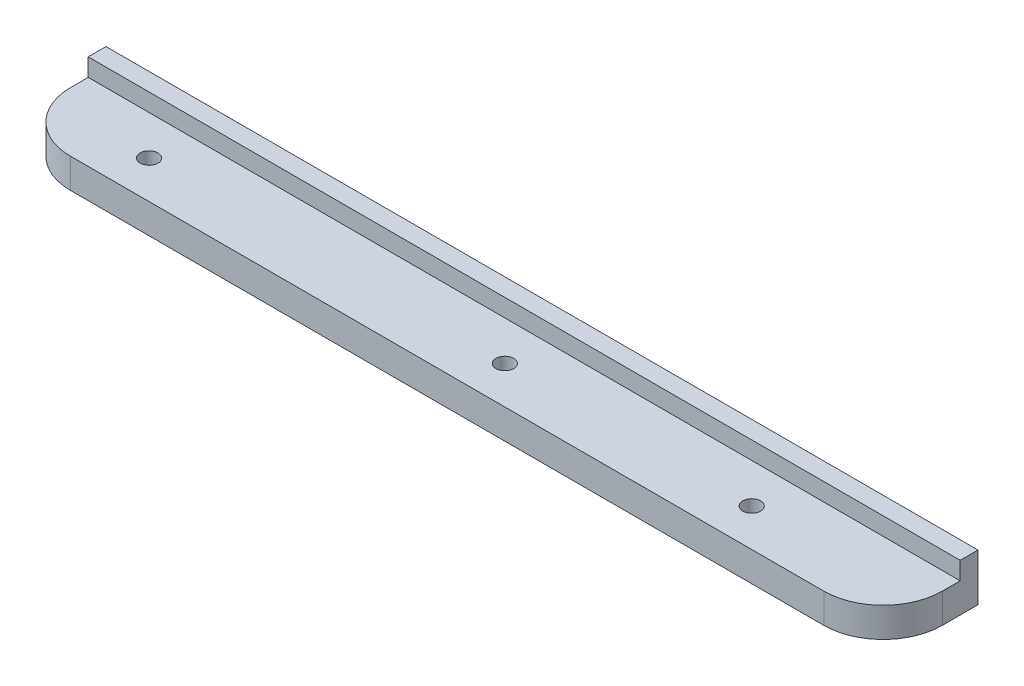
ISO-10303-21;
HEADER;
FILE_DESCRIPTION(('STEP AP214'),'2;1');
FILE_NAME('part.step','',(''),(''),'','','');
FILE_SCHEMA(('AUTOMOTIVE_DESIGN { 1 0 10303 214 1 1 1 1 }'));
ENDSEC;
DATA;
#1=APPLICATION_CONTEXT('core data for automotive mechanical design processes');
#2=APPLICATION_PROTOCOL_DEFINITION('international standard','automotive_design',2000,#1);
#3=PRODUCT_CONTEXT('',#1,'mechanical');
#4=PRODUCT('Part','Part','',(#3));
#5=PRODUCT_RELATED_PRODUCT_CATEGORY('part','',(#4));
#6=PRODUCT_DEFINITION_FORMATION('','',#4);
#7=PRODUCT_DEFINITION_CONTEXT('part definition',#1,'design');
#8=PRODUCT_DEFINITION('design','',#6,#7);
#9=PRODUCT_DEFINITION_SHAPE('','',#8);
#10=(LENGTH_UNIT() NAMED_UNIT(*) SI_UNIT(.MILLI.,.METRE.));
#11=(NAMED_UNIT(*) PLANE_ANGLE_UNIT() SI_UNIT($,.RADIAN.));
#12=(NAMED_UNIT(*) SI_UNIT($,.STERADIAN.) SOLID_ANGLE_UNIT());
#13=UNCERTAINTY_MEASURE_WITH_UNIT(LENGTH_MEASURE(1.E-05),#10,'distance_accuracy_value','');
#14=(GEOMETRIC_REPRESENTATION_CONTEXT(3) GLOBAL_UNCERTAINTY_ASSIGNED_CONTEXT((#13)) GLOBAL_UNIT_ASSIGNED_CONTEXT((#10,
#11,#12)) REPRESENTATION_CONTEXT('',''));
#15=CARTESIAN_POINT('',(0.,0.,0.));
#16=DIRECTION('',(0.,0.,1.));
#17=DIRECTION('',(1.,0.,0.));
#18=AXIS2_PLACEMENT_3D('',#15,#16,#17);
#19=CARTESIAN_POINT('',(0.,0.,0.));
#20=DIRECTION('',(0.,1.,0.));
#21=DIRECTION('',(0.,0.,1.));
#22=AXIS2_PLACEMENT_3D('',#19,#20,#21);
#23=PLANE('',#22);
#24=CARTESIAN_POINT('',(51.3328981723237,0.,-17.5797650130548));
#25=DIRECTION('',(0.,1.,0.));
#26=DIRECTION('',(0.,0.,1.));
#27=AXIS2_PLACEMENT_3D('',#24,#25,#26);
#28=CIRCLE('',#27,1.5);
#29=CARTESIAN_POINT('',(51.3328981723237,0.,-16.0797650130548));
#30=VERTEX_POINT('',#29);
#31=EDGE_CURVE('E171',#30,#30,#28,.T.);
#32=ORIENTED_EDGE('',*,*,#31,.T.);
#33=EDGE_LOOP('',(#32));
#34=FACE_BOUND('',#33,.T.);
#35=CARTESIAN_POINT('',(9.72289817232375,0.,-17.5797650130548));
#36=DIRECTION('',(0.,1.,0.));
#37=DIRECTION('',(0.,0.,1.));
#38=AXIS2_PLACEMENT_3D('',#35,#36,#37);
#39=CIRCLE('',#38,1.5);
#40=CARTESIAN_POINT('',(9.72289817232375,0.,-16.0797650130548));
#41=VERTEX_POINT('',#40);
#42=EDGE_CURVE('E167',#41,#41,#39,.T.);
#43=ORIENTED_EDGE('',*,*,#42,.T.);
#44=EDGE_LOOP('',(#43));
#45=FACE_BOUND('',#44,.T.);
#46=CARTESIAN_POINT('',(-50.2671018276763,0.,-17.5797650130548));
#47=DIRECTION('',(0.,1.,0.));
#48=DIRECTION('',(0.,0.,1.));
#49=AXIS2_PLACEMENT_3D('',#46,#47,#48);
#50=CIRCLE('',#49,1.5);
#51=CARTESIAN_POINT('',(-50.2671018276763,0.,-16.0797650130548));
#52=VERTEX_POINT('',#51);
#53=EDGE_CURVE('E164',#52,#52,#50,.T.);
#54=ORIENTED_EDGE('',*,*,#53,.T.);
#55=EDGE_LOOP('',(#54));
#56=FACE_BOUND('',#55,.T.);
#57=DIRECTION('',(-1.,0.,0.));
#58=VECTOR('',#57,1.);
#59=CARTESIAN_POINT('',(0.,0.,-27.2297650130548));
#60=LINE('',#59,#58);
#61=CARTESIAN_POINT('',(79.8328981723238,0.,-27.2297650130548));
#62=VERTEX_POINT('',#61);
#63=CARTESIAN_POINT('',(-67.1671018276762,0.,-27.2297650130548));
#64=VERTEX_POINT('',#63);
#65=EDGE_CURVE('E103',#62,#64,#60,.T.);
#66=ORIENTED_EDGE('',*,*,#65,.F.);
#67=DIRECTION('',(0.,0.,1.));
#68=VECTOR('',#67,1.);
#69=CARTESIAN_POINT('',(79.8328981723237,0.,0.));
#70=LINE('',#69,#68);
#71=CARTESIAN_POINT('',(79.8328981723238,0.,-21.2297650130548));
#72=VERTEX_POINT('',#71);
#73=EDGE_CURVE('E112',#62,#72,#70,.T.);
#74=ORIENTED_EDGE('',*,*,#73,.T.);
#75=CARTESIAN_POINT('',(69.8328981723238,0.,-21.2297650130548));
#76=DIRECTION('',(0.,1.,0.));
#77=DIRECTION('',(0.,0.,1.));
#78=AXIS2_PLACEMENT_3D('',#75,#76,#77);
#79=CIRCLE('',#78,10.);
#80=CARTESIAN_POINT('',(69.8328981723238,0.,-11.2297650130548));
#81=VERTEX_POINT('',#80);
#82=EDGE_CURVE('E57',#72,#81,#79,.F.);
#83=ORIENTED_EDGE('',*,*,#82,.T.);
#84=DIRECTION('',(-1.,0.,0.));
#85=VECTOR('',#84,1.);
#86=CARTESIAN_POINT('',(0.,0.,-11.2297650130548));
#87=LINE('',#86,#85);
#88=CARTESIAN_POINT('',(-57.1671018276763,0.,-11.2297650130548));
#89=VERTEX_POINT('',#88);
#90=EDGE_CURVE('E123',#81,#89,#87,.T.);
#91=ORIENTED_EDGE('',*,*,#90,.T.);
#92=CARTESIAN_POINT('',(-57.1671018276763,0.,-21.2297650130548));
#93=DIRECTION('',(0.,1.,0.));
#94=DIRECTION('',(0.,0.,1.));
#95=AXIS2_PLACEMENT_3D('',#92,#93,#94);
#96=CIRCLE('',#95,10.);
#97=CARTESIAN_POINT('',(-67.1671018276762,0.,-21.2297650130548));
#98=VERTEX_POINT('',#97);
#99=EDGE_CURVE('E134',#89,#98,#96,.F.);
#100=ORIENTED_EDGE('',*,*,#99,.T.);
#101=DIRECTION('',(0.,0.,1.));
#102=VECTOR('',#101,1.);
#103=CARTESIAN_POINT('',(-67.1671018276762,0.,0.));
#104=LINE('',#103,#102);
#105=EDGE_CURVE('E114',#64,#98,#104,.T.);
#106=ORIENTED_EDGE('',*,*,#105,.F.);
#107=EDGE_LOOP('',(#66,#74,#83,#91,#100,#106));
#108=FACE_BOUND('',#107,.T.);
#109=ADVANCED_FACE('F35',(#34,#45,#56,#108),#23,.F.);
#110=CARTESIAN_POINT('',(-67.1671018276762,5.,0.));
#111=DIRECTION('',(1.,0.,0.));
#112=DIRECTION('',(0.,0.,-1.));
#113=AXIS2_PLACEMENT_3D('',#110,#111,#112);
#114=PLANE('',#113);
#115=ORIENTED_EDGE('',*,*,#105,.T.);
#116=DIRECTION('',(0.,-1.,0.));
#117=VECTOR('',#116,1.);
#118=CARTESIAN_POINT('',(-67.1671018276762,5.,-21.2297650130548));
#119=LINE('',#118,#117);
#120=CARTESIAN_POINT('',(-67.1671018276762,5.,-21.2297650130548));
#121=VERTEX_POINT('',#120);
#122=EDGE_CURVE('E137',#98,#121,#119,.F.);
#123=ORIENTED_EDGE('',*,*,#122,.T.);
#124=DIRECTION('',(0.,0.,1.));
#125=VECTOR('',#124,1.);
#126=CARTESIAN_POINT('',(-67.1671018276762,5.,0.));
#127=LINE('',#126,#125);
#128=CARTESIAN_POINT('',(-67.1671018276762,5.,-24.2297650130548));
#129=VERTEX_POINT('',#128);
#130=EDGE_CURVE('E152',#129,#121,#127,.T.);
#131=ORIENTED_EDGE('',*,*,#130,.F.);
#132=DIRECTION('',(0.,-1.,0.));
#133=VECTOR('',#132,1.);
#134=CARTESIAN_POINT('',(-67.1671018276762,8.,-24.2297650130548));
#135=LINE('',#134,#133);
#136=CARTESIAN_POINT('',(-67.1671018276762,8.,-24.2297650130548));
#137=VERTEX_POINT('',#136);
#138=EDGE_CURVE('E168',#137,#129,#135,.T.);
#139=ORIENTED_EDGE('',*,*,#138,.F.);
#140=DIRECTION('',(0.,0.,1.));
#141=VECTOR('',#140,1.);
#142=CARTESIAN_POINT('',(-67.1671018276762,8.,-24.2297650130548));
#143=LINE('',#142,#141);
#144=CARTESIAN_POINT('',(-67.1671018276762,8.,-27.2297650130548));
#145=VERTEX_POINT('',#144);
#146=EDGE_CURVE('E178',#145,#137,#143,.T.);
#147=ORIENTED_EDGE('',*,*,#146,.F.);
#148=DIRECTION('',(0.,-1.,0.));
#149=VECTOR('',#148,1.);
#150=CARTESIAN_POINT('',(-67.1671018276762,8.,-27.2297650130548));
#151=LINE('',#150,#149);
#152=EDGE_CURVE('E110',#145,#64,#151,.T.);
#153=ORIENTED_EDGE('',*,*,#152,.T.);
#154=EDGE_LOOP('',(#115,#123,#131,#139,#147,#153));
#155=FACE_BOUND('',#154,.T.);
#156=ADVANCED_FACE('F174',(#155),#114,.F.);
#157=CARTESIAN_POINT('',(0.,5.,-11.2297650130548));
#158=DIRECTION('',(0.,0.,1.));
#159=DIRECTION('',(1.,0.,0.));
#160=AXIS2_PLACEMENT_3D('',#157,#158,#159);
#161=PLANE('',#160);
#162=ORIENTED_EDGE('',*,*,#90,.F.);
#163=DIRECTION('',(0.,-1.,0.));
#164=VECTOR('',#163,1.);
#165=CARTESIAN_POINT('',(69.8328981723238,5.,-11.2297650130548));
#166=LINE('',#165,#164);
#167=CARTESIAN_POINT('',(69.8328981723238,5.,-11.2297650130548));
#168=VERTEX_POINT('',#167);
#169=EDGE_CURVE('E43',#81,#168,#166,.F.);
#170=ORIENTED_EDGE('',*,*,#169,.T.);
#171=DIRECTION('',(-1.,0.,0.));
#172=VECTOR('',#171,1.);
#173=CARTESIAN_POINT('',(0.,5.,-11.2297650130548));
#174=LINE('',#173,#172);
#175=CARTESIAN_POINT('',(-57.1671018276763,5.,-11.2297650130548));
#176=VERTEX_POINT('',#175);
#177=EDGE_CURVE('E149',#168,#176,#174,.T.);
#178=ORIENTED_EDGE('',*,*,#177,.T.);
#179=DIRECTION('',(0.,-1.,0.));
#180=VECTOR('',#179,1.);
#181=CARTESIAN_POINT('',(-57.1671018276763,0.,-11.2297650130548));
#182=LINE('',#181,#180);
#183=EDGE_CURVE('E131',#176,#89,#182,.T.);
#184=ORIENTED_EDGE('',*,*,#183,.T.);
#185=EDGE_LOOP('',(#162,#170,#178,#184));
#186=FACE_BOUND('',#185,.T.);
#187=ADVANCED_FACE('F157',(#186),#161,.T.);
#188=CARTESIAN_POINT('',(79.8328981723237,5.,0.));
#189=DIRECTION('',(1.,0.,0.));
#190=DIRECTION('',(0.,0.,-1.));
#191=AXIS2_PLACEMENT_3D('',#188,#189,#190);
#192=PLANE('',#191);
#193=DIRECTION('',(0.,0.,1.));
#194=VECTOR('',#193,1.);
#195=CARTESIAN_POINT('',(79.8328981723237,5.,0.));
#196=LINE('',#195,#194);
#197=CARTESIAN_POINT('',(79.8328981723238,5.,-24.2297650130548));
#198=VERTEX_POINT('',#197);
#199=CARTESIAN_POINT('',(79.8328981723238,5.,-21.2297650130548));
#200=VERTEX_POINT('',#199);
#201=EDGE_CURVE('E135',#198,#200,#196,.T.);
#202=ORIENTED_EDGE('',*,*,#201,.T.);
#203=DIRECTION('',(0.,-1.,0.));
#204=VECTOR('',#203,1.);
#205=CARTESIAN_POINT('',(79.8328981723238,5.,-21.2297650130548));
#206=LINE('',#205,#204);
#207=EDGE_CURVE('E121',#200,#72,#206,.T.);
#208=ORIENTED_EDGE('',*,*,#207,.T.);
#209=ORIENTED_EDGE('',*,*,#73,.F.);
#210=DIRECTION('',(0.,-1.,0.));
#211=VECTOR('',#210,1.);
#212=CARTESIAN_POINT('',(79.8328981723238,8.,-27.2297650130548));
#213=LINE('',#212,#211);
#214=CARTESIAN_POINT('',(79.8328981723238,8.,-27.2297650130548));
#215=VERTEX_POINT('',#214);
#216=EDGE_CURVE('E99',#215,#62,#213,.T.);
#217=ORIENTED_EDGE('',*,*,#216,.F.);
#218=DIRECTION('',(0.,0.,-1.));
#219=VECTOR('',#218,1.);
#220=CARTESIAN_POINT('',(79.8328981723238,8.,-24.2297650130548));
#221=LINE('',#220,#219);
#222=CARTESIAN_POINT('',(79.8328981723238,8.,-24.2297650130548));
#223=VERTEX_POINT('',#222);
#224=EDGE_CURVE('E180',#223,#215,#221,.T.);
#225=ORIENTED_EDGE('',*,*,#224,.F.);
#226=DIRECTION('',(0.,-1.,0.));
#227=VECTOR('',#226,1.);
#228=CARTESIAN_POINT('',(79.8328981723238,8.,-24.2297650130548));
#229=LINE('',#228,#227);
#230=EDGE_CURVE('E109',#223,#198,#229,.T.);
#231=ORIENTED_EDGE('',*,*,#230,.T.);
#232=EDGE_LOOP('',(#202,#208,#209,#217,#225,#231));
#233=FACE_BOUND('',#232,.T.);
#234=ADVANCED_FACE('F119',(#233),#192,.T.);
#235=CARTESIAN_POINT('',(51.3328981723237,5.,-17.5797650130548));
#236=DIRECTION('',(0.,-1.,0.));
#237=DIRECTION('',(0.,0.,-1.));
#238=AXIS2_PLACEMENT_3D('',#235,#236,#237);
#239=CYLINDRICAL_SURFACE('',#238,1.5);
#240=CARTESIAN_POINT('',(51.3328981723237,5.,-17.5797650130548));
#241=DIRECTION('',(0.,1.,0.));
#242=DIRECTION('',(0.,0.,1.));
#243=AXIS2_PLACEMENT_3D('',#240,#241,#242);
#244=CIRCLE('',#243,1.5);
#245=CARTESIAN_POINT('',(51.3328981723237,5.,-16.0797650130548));
#246=VERTEX_POINT('',#245);
#247=EDGE_CURVE('E160',#246,#246,#244,.T.);
#248=ORIENTED_EDGE('',*,*,#247,.T.);
#249=EDGE_LOOP('',(#248));
#250=FACE_BOUND('',#249,.T.);
#251=ORIENTED_EDGE('',*,*,#31,.F.);
#252=EDGE_LOOP('',(#251));
#253=FACE_BOUND('',#252,.T.);
#254=ADVANCED_FACE('F192',(#250,#253),#239,.F.);
#255=CARTESIAN_POINT('',(9.72289817232375,5.,-17.5797650130548));
#256=DIRECTION('',(0.,-1.,0.));
#257=DIRECTION('',(0.,0.,-1.));
#258=AXIS2_PLACEMENT_3D('',#255,#256,#257);
#259=CYLINDRICAL_SURFACE('',#258,1.5);
#260=CARTESIAN_POINT('',(9.72289817232375,5.,-17.5797650130548));
#261=DIRECTION('',(0.,1.,0.));
#262=DIRECTION('',(0.,0.,1.));
#263=AXIS2_PLACEMENT_3D('',#260,#261,#262);
#264=CIRCLE('',#263,1.5);
#265=CARTESIAN_POINT('',(9.72289817232375,5.,-16.0797650130548));
#266=VERTEX_POINT('',#265);
#267=EDGE_CURVE('E126',#266,#266,#264,.T.);
#268=ORIENTED_EDGE('',*,*,#267,.T.);
#269=EDGE_LOOP('',(#268));
#270=FACE_BOUND('',#269,.T.);
#271=ORIENTED_EDGE('',*,*,#42,.F.);
#272=EDGE_LOOP('',(#271));
#273=FACE_BOUND('',#272,.T.);
#274=ADVANCED_FACE('F207',(#270,#273),#259,.F.);
#275=CARTESIAN_POINT('',(-50.2671018276763,5.,-17.5797650130548));
#276=DIRECTION('',(0.,-1.,0.));
#277=DIRECTION('',(0.,0.,-1.));
#278=AXIS2_PLACEMENT_3D('',#275,#276,#277);
#279=CYLINDRICAL_SURFACE('',#278,1.5);
#280=CARTESIAN_POINT('',(-50.2671018276763,5.,-17.5797650130548));
#281=DIRECTION('',(0.,1.,0.));
#282=DIRECTION('',(0.,0.,1.));
#283=AXIS2_PLACEMENT_3D('',#280,#281,#282);
#284=CIRCLE('',#283,1.5);
#285=CARTESIAN_POINT('',(-50.2671018276763,5.,-16.0797650130548));
#286=VERTEX_POINT('',#285);
#287=EDGE_CURVE('E122',#286,#286,#284,.T.);
#288=ORIENTED_EDGE('',*,*,#287,.T.);
#289=EDGE_LOOP('',(#288));
#290=FACE_BOUND('',#289,.T.);
#291=ORIENTED_EDGE('',*,*,#53,.F.);
#292=EDGE_LOOP('',(#291));
#293=FACE_BOUND('',#292,.T.);
#294=ADVANCED_FACE('F197',(#290,#293),#279,.F.);
#295=CARTESIAN_POINT('',(0.,5.,0.));
#296=DIRECTION('',(0.,1.,0.));
#297=DIRECTION('',(0.,0.,1.));
#298=AXIS2_PLACEMENT_3D('',#295,#296,#297);
#299=PLANE('',#298);
#300=ORIENTED_EDGE('',*,*,#177,.F.);
#301=CARTESIAN_POINT('',(69.8328981723238,5.,-21.2297650130548));
#302=DIRECTION('',(0.,1.,0.));
#303=DIRECTION('',(0.,0.,1.));
#304=AXIS2_PLACEMENT_3D('',#301,#302,#303);
#305=CIRCLE('',#304,10.);
#306=EDGE_CURVE('E11',#168,#200,#305,.T.);
#307=ORIENTED_EDGE('',*,*,#306,.T.);
#308=ORIENTED_EDGE('',*,*,#201,.F.);
#309=DIRECTION('',(1.,0.,0.));
#310=VECTOR('',#309,1.);
#311=CARTESIAN_POINT('',(-67.1671018276762,5.,-24.2297650130548));
#312=LINE('',#311,#310);
#313=EDGE_CURVE('E115',#129,#198,#312,.T.);
#314=ORIENTED_EDGE('',*,*,#313,.F.);
#315=ORIENTED_EDGE('',*,*,#130,.T.);
#316=CARTESIAN_POINT('',(-57.1671018276763,5.,-21.2297650130548));
#317=DIRECTION('',(0.,1.,0.));
#318=DIRECTION('',(0.,0.,1.));
#319=AXIS2_PLACEMENT_3D('',#316,#317,#318);
#320=CIRCLE('',#319,10.);
#321=EDGE_CURVE('E139',#121,#176,#320,.T.);
#322=ORIENTED_EDGE('',*,*,#321,.T.);
#323=EDGE_LOOP('',(#300,#307,#308,#314,#315,#322));
#324=FACE_BOUND('',#323,.T.);
#325=ORIENTED_EDGE('',*,*,#287,.F.);
#326=EDGE_LOOP('',(#325));
#327=FACE_BOUND('',#326,.T.);
#328=ORIENTED_EDGE('',*,*,#267,.F.);
#329=EDGE_LOOP('',(#328));
#330=FACE_BOUND('',#329,.T.);
#331=ORIENTED_EDGE('',*,*,#247,.F.);
#332=EDGE_LOOP('',(#331));
#333=FACE_BOUND('',#332,.T.);
#334=ADVANCED_FACE('F147',(#324,#327,#330,#333),#299,.T.);
#335=CARTESIAN_POINT('',(-67.1671018276762,8.,-24.2297650130548));
#336=DIRECTION('',(0.,0.,-1.));
#337=DIRECTION('',(-1.,0.,0.));
#338=AXIS2_PLACEMENT_3D('',#335,#336,#337);
#339=PLANE('',#338);
#340=ORIENTED_EDGE('',*,*,#313,.T.);
#341=ORIENTED_EDGE('',*,*,#230,.F.);
#342=DIRECTION('',(1.,0.,0.));
#343=VECTOR('',#342,1.);
#344=CARTESIAN_POINT('',(-67.1671018276762,8.,-24.2297650130548));
#345=LINE('',#344,#343);
#346=EDGE_CURVE('E240',#137,#223,#345,.T.);
#347=ORIENTED_EDGE('',*,*,#346,.F.);
#348=ORIENTED_EDGE('',*,*,#138,.T.);
#349=EDGE_LOOP('',(#340,#341,#347,#348));
#350=FACE_BOUND('',#349,.T.);
#351=ADVANCED_FACE('F196',(#350),#339,.F.);
#352=CARTESIAN_POINT('',(-67.1671018276762,8.,-27.2297650130548));
#353=DIRECTION('',(0.,0.,1.));
#354=DIRECTION('',(1.,0.,0.));
#355=AXIS2_PLACEMENT_3D('',#352,#353,#354);
#356=PLANE('',#355);
#357=ORIENTED_EDGE('',*,*,#216,.T.);
#358=ORIENTED_EDGE('',*,*,#65,.T.);
#359=ORIENTED_EDGE('',*,*,#152,.F.);
#360=DIRECTION('',(-1.,0.,0.));
#361=VECTOR('',#360,1.);
#362=CARTESIAN_POINT('',(-67.1671018276762,8.,-27.2297650130548));
#363=LINE('',#362,#361);
#364=EDGE_CURVE('E105',#215,#145,#363,.T.);
#365=ORIENTED_EDGE('',*,*,#364,.F.);
#366=EDGE_LOOP('',(#357,#358,#359,#365));
#367=FACE_BOUND('',#366,.T.);
#368=ADVANCED_FACE('F101',(#367),#356,.F.);
#369=CARTESIAN_POINT('',(0.,8.,0.));
#370=DIRECTION('',(0.,-1.,0.));
#371=DIRECTION('',(0.,0.,-1.));
#372=AXIS2_PLACEMENT_3D('',#369,#370,#371);
#373=PLANE('',#372);
#374=ORIENTED_EDGE('',*,*,#146,.T.);
#375=ORIENTED_EDGE('',*,*,#346,.T.);
#376=ORIENTED_EDGE('',*,*,#224,.T.);
#377=ORIENTED_EDGE('',*,*,#364,.T.);
#378=EDGE_LOOP('',(#374,#375,#376,#377));
#379=FACE_BOUND('',#378,.T.);
#380=ADVANCED_FACE('F227',(#379),#373,.F.);
#381=CARTESIAN_POINT('',(-57.1671018276763,5.,-21.2297650130548));
#382=DIRECTION('',(0.,1.,0.));
#383=DIRECTION('',(0.,0.,1.));
#384=AXIS2_PLACEMENT_3D('',#381,#382,#383);
#385=CYLINDRICAL_SURFACE('',#384,10.);
#386=ORIENTED_EDGE('',*,*,#321,.F.);
#387=ORIENTED_EDGE('',*,*,#122,.F.);
#388=ORIENTED_EDGE('',*,*,#99,.F.);
#389=ORIENTED_EDGE('',*,*,#183,.F.);
#390=EDGE_LOOP('',(#386,#387,#388,#389));
#391=FACE_BOUND('',#390,.T.);
#392=ADVANCED_FACE('F156',(#391),#385,.T.);
#393=CARTESIAN_POINT('',(69.8328981723238,5.,-21.2297650130548));
#394=DIRECTION('',(0.,-1.,0.));
#395=DIRECTION('',(0.,0.,-1.));
#396=AXIS2_PLACEMENT_3D('',#393,#394,#395);
#397=CYLINDRICAL_SURFACE('',#396,10.);
#398=ORIENTED_EDGE('',*,*,#306,.F.);
#399=ORIENTED_EDGE('',*,*,#169,.F.);
#400=ORIENTED_EDGE('',*,*,#82,.F.);
#401=ORIENTED_EDGE('',*,*,#207,.F.);
#402=EDGE_LOOP('',(#398,#399,#400,#401));
#403=FACE_BOUND('',#402,.T.);
#404=ADVANCED_FACE('F37',(#403),#397,.T.);
#405=CLOSED_SHELL('',(#109,#156,#187,#234,#254,#274,#294,#334,#351,#368,#380,#392,#404));
#406=MANIFOLD_SOLID_BREP('B2',#405);
#407=ADVANCED_BREP_SHAPE_REPRESENTATION('',(#18,#406),#14);
#408=SHAPE_DEFINITION_REPRESENTATION(#9,#407);
ENDSEC;
END-ISO-10303-21;
